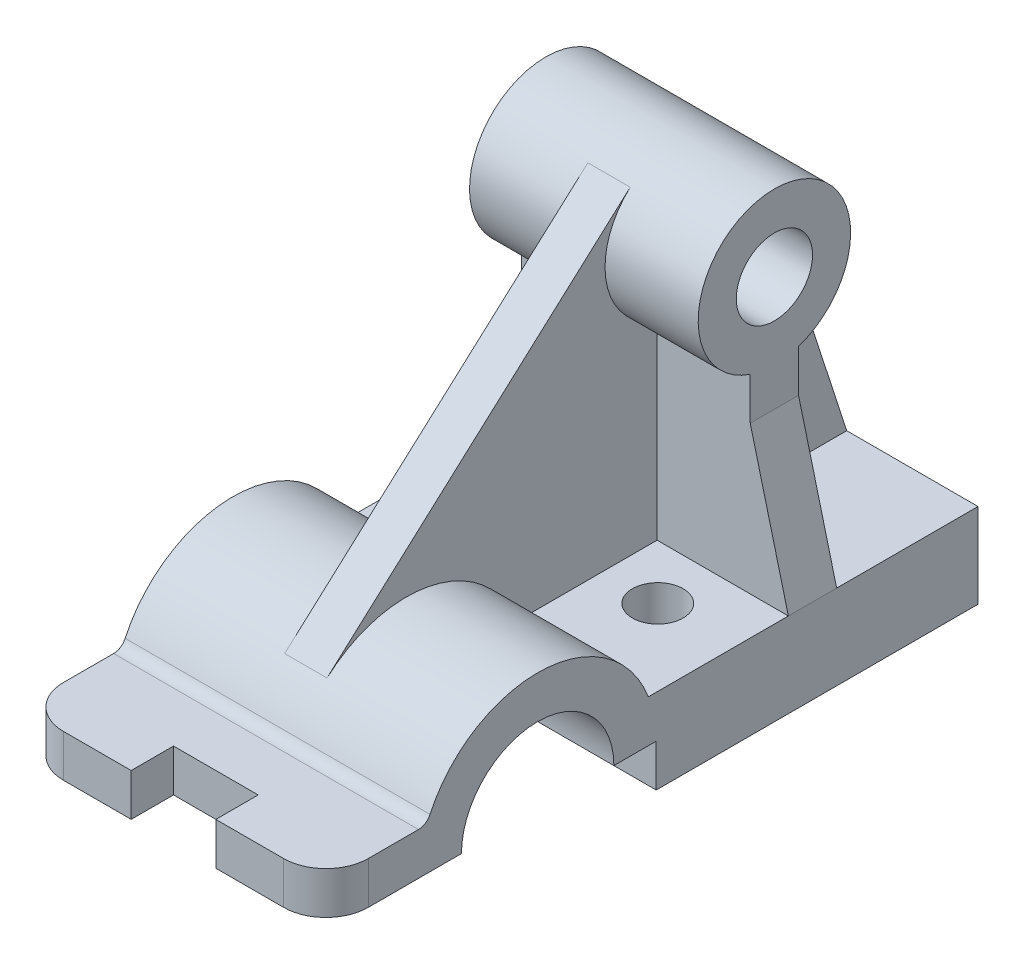
ISO-10303-21;
HEADER;
FILE_DESCRIPTION(('STEP AP214'),'2;1');
FILE_NAME('part.step','',(''),(''),'','','');
FILE_SCHEMA(('AUTOMOTIVE_DESIGN { 1 0 10303 214 1 1 1 1 }'));
ENDSEC;
DATA;
#1=APPLICATION_CONTEXT('core data for automotive mechanical design processes');
#2=APPLICATION_PROTOCOL_DEFINITION('international standard','automotive_design',2000,#1);
#3=PRODUCT_CONTEXT('',#1,'mechanical');
#4=PRODUCT('Part','Part','',(#3));
#5=PRODUCT_RELATED_PRODUCT_CATEGORY('part','',(#4));
#6=PRODUCT_DEFINITION_FORMATION('','',#4);
#7=PRODUCT_DEFINITION_CONTEXT('part definition',#1,'design');
#8=PRODUCT_DEFINITION('design','',#6,#7);
#9=PRODUCT_DEFINITION_SHAPE('','',#8);
#10=(LENGTH_UNIT() NAMED_UNIT(*) SI_UNIT(.MILLI.,.METRE.));
#11=(NAMED_UNIT(*) PLANE_ANGLE_UNIT() SI_UNIT($,.RADIAN.));
#12=(NAMED_UNIT(*) SI_UNIT($,.STERADIAN.) SOLID_ANGLE_UNIT());
#13=UNCERTAINTY_MEASURE_WITH_UNIT(LENGTH_MEASURE(1.E-05),#10,'distance_accuracy_value','');
#14=(GEOMETRIC_REPRESENTATION_CONTEXT(3) GLOBAL_UNCERTAINTY_ASSIGNED_CONTEXT((#13)) GLOBAL_UNIT_ASSIGNED_CONTEXT((#10,
#11,#12)) REPRESENTATION_CONTEXT('',''));
#15=CARTESIAN_POINT('',(0.,0.,0.));
#16=DIRECTION('',(0.,0.,1.));
#17=DIRECTION('',(1.,0.,0.));
#18=AXIS2_PLACEMENT_3D('',#15,#16,#17);
#19=CARTESIAN_POINT('',(-26.,20.,67.));
#20=DIRECTION('',(0.,-1.,0.));
#21=DIRECTION('',(0.,0.,-1.));
#22=AXIS2_PLACEMENT_3D('',#19,#20,#21);
#23=PLANE('',#22);
#24=DIRECTION('',(0.,0.,-1.));
#25=VECTOR('',#24,1.);
#26=CARTESIAN_POINT('',(-5.,20.,-43.6192714453584));
#27=LINE('',#26,#25);
#28=CARTESIAN_POINT('',(-5.,20.,-43.6192714453584));
#29=VERTEX_POINT('',#28);
#30=CARTESIAN_POINT('',(-5.,20.,-77.));
#31=VERTEX_POINT('',#30);
#32=EDGE_CURVE('E529',#29,#31,#27,.T.);
#33=ORIENTED_EDGE('',*,*,#32,.T.);
#34=DIRECTION('',(-1.,0.,0.));
#35=VECTOR('',#34,1.);
#36=CARTESIAN_POINT('',(-36.,20.,-77.));
#37=LINE('',#36,#35);
#38=CARTESIAN_POINT('',(-36.,20.,-77.));
#39=VERTEX_POINT('',#38);
#40=EDGE_CURVE('E413',#31,#39,#37,.T.);
#41=ORIENTED_EDGE('',*,*,#40,.T.);
#42=DIRECTION('',(0.,0.,1.));
#43=VECTOR('',#42,1.);
#44=CARTESIAN_POINT('',(-36.,20.,66.9999999999999));
#45=LINE('',#44,#43);
#46=CARTESIAN_POINT('',(-36.,20.,-43.6192714453584));
#47=VERTEX_POINT('',#46);
#48=EDGE_CURVE('E420',#39,#47,#45,.T.);
#49=ORIENTED_EDGE('',*,*,#48,.T.);
#50=DIRECTION('',(1.,0.,0.));
#51=VECTOR('',#50,1.);
#52=CARTESIAN_POINT('',(-26.,20.,-43.6192714453584));
#53=LINE('',#52,#51);
#54=EDGE_CURVE('E12',#47,#29,#53,.T.);
#55=ORIENTED_EDGE('',*,*,#54,.T.);
#56=EDGE_LOOP('',(#33,#41,#49,#55));
#57=FACE_BOUND('',#56,.T.);
#58=ADVANCED_FACE('F43',(#57),#23,.F.);
#59=CARTESIAN_POINT('',(36.,19.9278929021557,-43.6192714453584));
#60=DIRECTION('',(0.,0.,-1.));
#61=DIRECTION('',(-1.,0.,0.));
#62=AXIS2_PLACEMENT_3D('',#59,#60,#61);
#63=PLANE('',#62);
#64=DIRECTION('',(-1.,0.,0.));
#65=VECTOR('',#64,1.);
#66=CARTESIAN_POINT('',(36.,64.9278929021557,-43.6192714453584));
#67=LINE('',#66,#65);
#68=CARTESIAN_POINT('',(-5.,64.9278929021557,-43.6192714453584));
#69=VERTEX_POINT('',#68);
#70=CARTESIAN_POINT('',(-27.,64.9278929021557,-43.6192714453584));
#71=VERTEX_POINT('',#70);
#72=EDGE_CURVE('E280',#69,#71,#67,.T.);
#73=ORIENTED_EDGE('',*,*,#72,.F.);
#74=DIRECTION('',(0.,-1.,0.));
#75=VECTOR('',#74,1.);
#76=CARTESIAN_POINT('',(-5.,64.9278929021557,-43.6192714453584));
#77=LINE('',#76,#75);
#78=EDGE_CURVE('E58',#69,#29,#77,.T.);
#79=ORIENTED_EDGE('',*,*,#78,.T.);
#80=ORIENTED_EDGE('',*,*,#54,.F.);
#81=DIRECTION('',(-0.249523194065866,-0.968368822104041,0.));
#82=VECTOR('',#81,1.);
#83=CARTESIAN_POINT('',(-27.,54.9278929021557,-43.6192714453584));
#84=LINE('',#83,#82);
#85=CARTESIAN_POINT('',(-27.,54.9278929021557,-43.6192714453584));
#86=VERTEX_POINT('',#85);
#87=EDGE_CURVE('E511',#86,#47,#84,.T.);
#88=ORIENTED_EDGE('',*,*,#87,.F.);
#89=DIRECTION('',(0.,-1.,0.));
#90=VECTOR('',#89,1.);
#91=CARTESIAN_POINT('',(-27.,64.9278929021557,-43.6192714453584));
#92=LINE('',#91,#90);
#93=EDGE_CURVE('E514',#71,#86,#92,.T.);
#94=ORIENTED_EDGE('',*,*,#93,.F.);
#95=EDGE_LOOP('',(#73,#79,#80,#88,#94));
#96=FACE_BOUND('',#95,.T.);
#97=ADVANCED_FACE('F550',(#96),#63,.T.);
#98=CARTESIAN_POINT('',(18.,20.,-19.3671831588424));
#99=DIRECTION('',(0.,-1.,0.));
#100=DIRECTION('',(0.,0.,1.));
#101=AXIS2_PLACEMENT_3D('',#98,#99,#100);
#102=CIRCLE('',#101,6.);
#103=CARTESIAN_POINT('',(18.,20.,-13.3671831588424));
#104=VERTEX_POINT('',#103);
#105=EDGE_CURVE('E331',#104,#104,#102,.T.);
#106=ORIENTED_EDGE('',*,*,#105,.T.);
#107=EDGE_LOOP('',(#106));
#108=FACE_BOUND('',#107,.T.);
#109=DIRECTION('',(0.,0.,-1.));
#110=VECTOR('',#109,1.);
#111=CARTESIAN_POINT('',(36.,20.,66.9999999999999));
#112=LINE('',#111,#110);
#113=CARTESIAN_POINT('',(36.,20.,0.846606338755967));
#114=VERTEX_POINT('',#113);
#115=CARTESIAN_POINT('',(36.,20.,-32.2099490746416));
#116=VERTEX_POINT('',#115);
#117=EDGE_CURVE('E414',#114,#116,#112,.T.);
#118=ORIENTED_EDGE('',*,*,#117,.T.);
#119=DIRECTION('',(-1.,0.,0.));
#120=VECTOR('',#119,1.);
#121=CARTESIAN_POINT('',(-26.,20.,-32.2099490746416));
#122=LINE('',#121,#120);
#123=CARTESIAN_POINT('',(5.,20.,-32.2099490746416));
#124=VERTEX_POINT('',#123);
#125=EDGE_CURVE('E301',#116,#124,#122,.T.);
#126=ORIENTED_EDGE('',*,*,#125,.T.);
#127=DIRECTION('',(0.,0.,-1.));
#128=VECTOR('',#127,1.);
#129=CARTESIAN_POINT('',(5.,20.,0.846606338755959));
#130=LINE('',#129,#128);
#131=CARTESIAN_POINT('',(5.,20.,0.846606338755959));
#132=VERTEX_POINT('',#131);
#133=EDGE_CURVE('E304',#132,#124,#130,.T.);
#134=ORIENTED_EDGE('',*,*,#133,.F.);
#135=DIRECTION('',(-1.,0.,0.));
#136=VECTOR('',#135,1.);
#137=CARTESIAN_POINT('',(36.,20.,0.846606338755974));
#138=LINE('',#137,#136);
#139=EDGE_CURVE('E362',#132,#114,#138,.F.);
#140=ORIENTED_EDGE('',*,*,#139,.T.);
#141=EDGE_LOOP('',(#118,#126,#134,#140));
#142=FACE_BOUND('',#141,.T.);
#143=ADVANCED_FACE('F581',(#108,#142),#23,.F.);
#144=CARTESIAN_POINT('',(-18.,20.,-19.3671831588424));
#145=DIRECTION('',(0.,1.,0.));
#146=DIRECTION('',(0.,0.,1.));
#147=AXIS2_PLACEMENT_3D('',#144,#145,#146);
#148=CIRCLE('',#147,6.);
#149=CARTESIAN_POINT('',(-18.,20.,-13.3671831588424));
#150=VERTEX_POINT('',#149);
#151=EDGE_CURVE('E335',#150,#150,#148,.T.);
#152=ORIENTED_EDGE('',*,*,#151,.F.);
#153=EDGE_LOOP('',(#152));
#154=FACE_BOUND('',#153,.T.);
#155=DIRECTION('',(0.,0.,-1.));
#156=VECTOR('',#155,1.);
#157=CARTESIAN_POINT('',(-5.,20.,0.846606338755959));
#158=LINE('',#157,#156);
#159=CARTESIAN_POINT('',(-5.,20.,0.846606338755974));
#160=VERTEX_POINT('',#159);
#161=CARTESIAN_POINT('',(-5.,20.,-32.2099490746416));
#162=VERTEX_POINT('',#161);
#163=EDGE_CURVE('E318',#160,#162,#158,.T.);
#164=ORIENTED_EDGE('',*,*,#163,.T.);
#165=CARTESIAN_POINT('',(-36.,20.,-32.2099490746416));
#166=VERTEX_POINT('',#165);
#167=EDGE_CURVE('E66',#162,#166,#122,.T.);
#168=ORIENTED_EDGE('',*,*,#167,.T.);
#169=CARTESIAN_POINT('',(-36.,20.,0.846606338755967));
#170=VERTEX_POINT('',#169);
#171=EDGE_CURVE('E424',#166,#170,#45,.T.);
#172=ORIENTED_EDGE('',*,*,#171,.T.);
#173=EDGE_CURVE('E364',#170,#160,#138,.F.);
#174=ORIENTED_EDGE('',*,*,#173,.T.);
#175=EDGE_LOOP('',(#164,#168,#172,#174));
#176=FACE_BOUND('',#175,.T.);
#177=ADVANCED_FACE('F561',(#154,#176),#23,.F.);
#178=CARTESIAN_POINT('',(36.,10.,-0.999999999999987));
#179=DIRECTION('',(0.,1.,0.));
#180=DIRECTION('',(0.,0.,1.));
#181=AXIS2_PLACEMENT_3D('',#178,#179,#180);
#182=PLANE('',#181);
#183=DIRECTION('',(0.,0.,-1.));
#184=VECTOR('',#183,1.);
#185=CARTESIAN_POINT('',(36.,10.,-0.999999999999987));
#186=LINE('',#185,#184);
#187=CARTESIAN_POINT('',(36.,10.,9.00000000000001));
#188=VERTEX_POINT('',#187);
#189=CARTESIAN_POINT('',(36.,10.,-0.999999999999987));
#190=VERTEX_POINT('',#189);
#191=EDGE_CURVE('E388',#188,#190,#186,.T.);
#192=ORIENTED_EDGE('',*,*,#191,.F.);
#193=DIRECTION('',(-1.,0.,0.));
#194=VECTOR('',#193,1.);
#195=CARTESIAN_POINT('',(36.,10.,9.00000000000001));
#196=LINE('',#195,#194);
#197=CARTESIAN_POINT('',(-36.,10.,9.00000000000001));
#198=VERTEX_POINT('',#197);
#199=EDGE_CURVE('E470',#188,#198,#196,.T.);
#200=ORIENTED_EDGE('',*,*,#199,.T.);
#201=DIRECTION('',(0.,0.,-1.));
#202=VECTOR('',#201,1.);
#203=CARTESIAN_POINT('',(-36.,10.,-0.999999999999987));
#204=LINE('',#203,#202);
#205=CARTESIAN_POINT('',(-36.,10.,-0.999999999999987));
#206=VERTEX_POINT('',#205);
#207=EDGE_CURVE('E395',#198,#206,#204,.T.);
#208=ORIENTED_EDGE('',*,*,#207,.T.);
#209=DIRECTION('',(-1.,0.,0.));
#210=VECTOR('',#209,1.);
#211=CARTESIAN_POINT('',(36.,10.,-0.999999999999987));
#212=LINE('',#211,#210);
#213=EDGE_CURVE('E398',#190,#206,#212,.T.);
#214=ORIENTED_EDGE('',*,*,#213,.F.);
#215=EDGE_LOOP('',(#192,#200,#208,#214));
#216=FACE_BOUND('',#215,.T.);
#217=ADVANCED_FACE('F634',(#216),#182,.F.);
#218=CARTESIAN_POINT('',(36.,20.,66.9999999999999));
#219=VERTEX_POINT('',#218);
#220=CARTESIAN_POINT('',(36.,20.,55.1424945589406));
#221=VERTEX_POINT('',#220);
#222=EDGE_CURVE('E411',#219,#221,#112,.T.);
#223=ORIENTED_EDGE('',*,*,#222,.T.);
#224=DIRECTION('',(-1.,0.,0.));
#225=VECTOR('',#224,1.);
#226=CARTESIAN_POINT('',(36.,20.,55.1424945589406));
#227=LINE('',#226,#225);
#228=CARTESIAN_POINT('',(-36.,20.,55.1424945589406));
#229=VERTEX_POINT('',#228);
#230=EDGE_CURVE('E360',#221,#229,#227,.T.);
#231=ORIENTED_EDGE('',*,*,#230,.T.);
#232=CARTESIAN_POINT('',(-36.,20.,66.9999999999999));
#233=VERTEX_POINT('',#232);
#234=EDGE_CURVE('E419',#229,#233,#45,.T.);
#235=ORIENTED_EDGE('',*,*,#234,.T.);
#236=CARTESIAN_POINT('',(-26.,20.,67.));
#237=DIRECTION('',(0.,1.,0.));
#238=DIRECTION('',(0.,0.,-1.));
#239=AXIS2_PLACEMENT_3D('',#236,#237,#238);
#240=CIRCLE('',#239,10.);
#241=CARTESIAN_POINT('',(-25.9999999999999,20.,77.));
#242=VERTEX_POINT('',#241);
#243=EDGE_CURVE('E423',#233,#242,#240,.T.);
#244=ORIENTED_EDGE('',*,*,#243,.T.);
#245=DIRECTION('',(1.,0.,0.));
#246=VECTOR('',#245,1.);
#247=CARTESIAN_POINT('',(-25.9999999999999,20.,77.));
#248=LINE('',#247,#246);
#249=CARTESIAN_POINT('',(-10.,20.,77.));
#250=VERTEX_POINT('',#249);
#251=EDGE_CURVE('E427',#242,#250,#248,.T.);
#252=ORIENTED_EDGE('',*,*,#251,.T.);
#253=DIRECTION('',(0.,0.,1.));
#254=VECTOR('',#253,1.);
#255=CARTESIAN_POINT('',(-10.,20.,77.));
#256=LINE('',#255,#254);
#257=CARTESIAN_POINT('',(-10.,20.,67.));
#258=VERTEX_POINT('',#257);
#259=EDGE_CURVE('E367',#258,#250,#256,.T.);
#260=ORIENTED_EDGE('',*,*,#259,.F.);
#261=DIRECTION('',(-1.,0.,0.));
#262=VECTOR('',#261,1.);
#263=CARTESIAN_POINT('',(-10.,20.,67.));
#264=LINE('',#263,#262);
#265=CARTESIAN_POINT('',(10.,20.,67.));
#266=VERTEX_POINT('',#265);
#267=EDGE_CURVE('E372',#266,#258,#264,.T.);
#268=ORIENTED_EDGE('',*,*,#267,.F.);
#269=DIRECTION('',(0.,0.,-1.));
#270=VECTOR('',#269,1.);
#271=CARTESIAN_POINT('',(10.,20.,77.));
#272=LINE('',#271,#270);
#273=CARTESIAN_POINT('',(10.,20.,77.));
#274=VERTEX_POINT('',#273);
#275=EDGE_CURVE('E369',#274,#266,#272,.T.);
#276=ORIENTED_EDGE('',*,*,#275,.F.);
#277=CARTESIAN_POINT('',(25.9999999999999,20.,77.));
#278=VERTEX_POINT('',#277);
#279=EDGE_CURVE('E426',#274,#278,#248,.T.);
#280=ORIENTED_EDGE('',*,*,#279,.T.);
#281=CARTESIAN_POINT('',(26.,20.,67.));
#282=DIRECTION('',(0.,1.,0.));
#283=DIRECTION('',(0.,0.,-1.));
#284=AXIS2_PLACEMENT_3D('',#281,#282,#283);
#285=CIRCLE('',#284,10.);
#286=EDGE_CURVE('E430',#278,#219,#285,.T.);
#287=ORIENTED_EDGE('',*,*,#286,.T.);
#288=EDGE_LOOP('',(#223,#231,#235,#244,#252,#260,#268,#276,#280,#287));
#289=FACE_BOUND('',#288,.T.);
#290=ADVANCED_FACE('F620',(#289),#23,.F.);
#291=CARTESIAN_POINT('',(-25.9999999999999,20.,77.));
#292=DIRECTION('',(0.,0.,-1.));
#293=DIRECTION('',(-1.,0.,0.));
#294=AXIS2_PLACEMENT_3D('',#291,#292,#293);
#295=PLANE('',#294);
#296=DIRECTION('',(-1.,0.,0.));
#297=VECTOR('',#296,1.);
#298=CARTESIAN_POINT('',(36.,10.,77.));
#299=LINE('',#298,#297);
#300=CARTESIAN_POINT('',(-10.,10.,77.));
#301=VERTEX_POINT('',#300);
#302=CARTESIAN_POINT('',(-25.9999999999999,10.,77.));
#303=VERTEX_POINT('',#302);
#304=EDGE_CURVE('E405',#301,#303,#299,.T.);
#305=ORIENTED_EDGE('',*,*,#304,.F.);
#306=DIRECTION('',(0.,1.,0.));
#307=VECTOR('',#306,1.);
#308=CARTESIAN_POINT('',(-10.,0.,77.));
#309=LINE('',#308,#307);
#310=EDGE_CURVE('E375',#301,#250,#309,.T.);
#311=ORIENTED_EDGE('',*,*,#310,.T.);
#312=ORIENTED_EDGE('',*,*,#251,.F.);
#313=DIRECTION('',(0.,-1.,0.));
#314=VECTOR('',#313,1.);
#315=CARTESIAN_POINT('',(-25.9999999999999,20.,77.));
#316=LINE('',#315,#314);
#317=EDGE_CURVE('E444',#242,#303,#316,.T.);
#318=ORIENTED_EDGE('',*,*,#317,.T.);
#319=EDGE_LOOP('',(#305,#311,#312,#318));
#320=FACE_BOUND('',#319,.T.);
#321=ADVANCED_FACE('F633',(#320),#295,.F.);
#322=CARTESIAN_POINT('',(36.,20.,66.9999999999999));
#323=DIRECTION('',(-1.,0.,0.));
#324=DIRECTION('',(0.,0.,1.));
#325=AXIS2_PLACEMENT_3D('',#322,#323,#324);
#326=PLANE('',#325);
#327=DIRECTION('',(0.,0.,-1.));
#328=VECTOR('',#327,1.);
#329=CARTESIAN_POINT('',(36.,20.,77.001));
#330=LINE('',#329,#328);
#331=CARTESIAN_POINT('',(36.,20.,-43.6192714453584));
#332=VERTEX_POINT('',#331);
#333=EDGE_CURVE('E484',#116,#332,#330,.T.);
#334=ORIENTED_EDGE('',*,*,#333,.F.);
#335=ORIENTED_EDGE('',*,*,#117,.F.);
#336=CARTESIAN_POINT('',(36.,10.,27.));
#337=DIRECTION('',(-1.,0.,0.));
#338=DIRECTION('',(0.,0.,1.));
#339=AXIS2_PLACEMENT_3D('',#336,#337,#338);
#340=CIRCLE('',#339,28.);
#341=CARTESIAN_POINT('',(36.,21.741935483871,52.4190273435592));
#342=VERTEX_POINT('',#341);
#343=EDGE_CURVE('E347',#342,#114,#340,.T.);
#344=ORIENTED_EDGE('',*,*,#343,.F.);
#345=CARTESIAN_POINT('',(36.,23.,55.1424945589406));
#346=DIRECTION('',(-1.,0.,0.));
#347=DIRECTION('',(0.,0.,1.));
#348=AXIS2_PLACEMENT_3D('',#345,#346,#347);
#349=CIRCLE('',#348,3.);
#350=EDGE_CURVE('E344',#342,#221,#349,.T.);
#351=ORIENTED_EDGE('',*,*,#350,.T.);
#352=ORIENTED_EDGE('',*,*,#222,.F.);
#353=DIRECTION('',(0.,-1.,0.));
#354=VECTOR('',#353,1.);
#355=CARTESIAN_POINT('',(36.,20.,66.9999999999999));
#356=LINE('',#355,#354);
#357=CARTESIAN_POINT('',(36.,10.,67.));
#358=VERTEX_POINT('',#357);
#359=EDGE_CURVE('E432',#219,#358,#356,.T.);
#360=ORIENTED_EDGE('',*,*,#359,.T.);
#361=CARTESIAN_POINT('',(36.,10.,45.));
#362=VERTEX_POINT('',#361);
#363=EDGE_CURVE('E390',#358,#362,#186,.T.);
#364=ORIENTED_EDGE('',*,*,#363,.T.);
#365=CARTESIAN_POINT('',(36.,10.,27.));
#366=DIRECTION('',(-1.,0.,0.));
#367=DIRECTION('',(0.,0.,1.));
#368=AXIS2_PLACEMENT_3D('',#365,#366,#367);
#369=CIRCLE('',#368,18.);
#370=EDGE_CURVE('E351',#362,#188,#369,.T.);
#371=ORIENTED_EDGE('',*,*,#370,.T.);
#372=ORIENTED_EDGE('',*,*,#191,.T.);
#373=DIRECTION('',(0.,-1.,0.));
#374=VECTOR('',#373,1.);
#375=CARTESIAN_POINT('',(36.,0.,-0.999999999999987));
#376=LINE('',#375,#374);
#377=CARTESIAN_POINT('',(36.,0.,-0.999999999999987));
#378=VERTEX_POINT('',#377);
#379=EDGE_CURVE('E385',#190,#378,#376,.T.);
#380=ORIENTED_EDGE('',*,*,#379,.T.);
#381=DIRECTION('',(0.,0.,-1.));
#382=VECTOR('',#381,1.);
#383=CARTESIAN_POINT('',(36.,0.,66.9999999999999));
#384=LINE('',#383,#382);
#385=CARTESIAN_POINT('',(36.,0.,-77.));
#386=VERTEX_POINT('',#385);
#387=EDGE_CURVE('E410',#378,#386,#384,.T.);
#388=ORIENTED_EDGE('',*,*,#387,.T.);
#389=DIRECTION('',(0.,-1.,0.));
#390=VECTOR('',#389,1.);
#391=CARTESIAN_POINT('',(36.,20.,-77.));
#392=LINE('',#391,#390);
#393=CARTESIAN_POINT('',(36.,20.,-77.));
#394=VERTEX_POINT('',#393);
#395=EDGE_CURVE('E453',#394,#386,#392,.T.);
#396=ORIENTED_EDGE('',*,*,#395,.F.);
#397=EDGE_CURVE('E415',#332,#394,#112,.T.);
#398=ORIENTED_EDGE('',*,*,#397,.F.);
#399=EDGE_LOOP('',(#334,#335,#344,#351,#352,#360,#364,#371,#372,#380,#388,#396,#398));
#400=FACE_BOUND('',#399,.T.);
#401=ADVANCED_FACE('F45',(#400),#326,.F.);
#402=CARTESIAN_POINT('',(-36.,20.,-77.));
#403=DIRECTION('',(0.,0.,1.));
#404=DIRECTION('',(1.,0.,0.));
#405=AXIS2_PLACEMENT_3D('',#402,#403,#404);
#406=PLANE('',#405);
#407=DIRECTION('',(-1.,0.,0.));
#408=VECTOR('',#407,1.);
#409=CARTESIAN_POINT('',(-36.,0.,-77.));
#410=LINE('',#409,#408);
#411=CARTESIAN_POINT('',(-36.,0.,-77.));
#412=VERTEX_POINT('',#411);
#413=EDGE_CURVE('E434',#386,#412,#410,.T.);
#414=ORIENTED_EDGE('',*,*,#413,.T.);
#415=DIRECTION('',(0.,-1.,0.));
#416=VECTOR('',#415,1.);
#417=CARTESIAN_POINT('',(-36.,20.,-77.));
#418=LINE('',#417,#416);
#419=EDGE_CURVE('E450',#39,#412,#418,.T.);
#420=ORIENTED_EDGE('',*,*,#419,.F.);
#421=ORIENTED_EDGE('',*,*,#40,.F.);
#422=DIRECTION('',(-1.,0.,0.));
#423=VECTOR('',#422,1.);
#424=CARTESIAN_POINT('',(5.,20.,-77.));
#425=LINE('',#424,#423);
#426=CARTESIAN_POINT('',(5.,20.,-77.));
#427=VERTEX_POINT('',#426);
#428=EDGE_CURVE('E508',#427,#31,#425,.T.);
#429=ORIENTED_EDGE('',*,*,#428,.F.);
#430=EDGE_CURVE('E416',#394,#427,#37,.T.);
#431=ORIENTED_EDGE('',*,*,#430,.F.);
#432=ORIENTED_EDGE('',*,*,#395,.T.);
#433=EDGE_LOOP('',(#414,#420,#421,#429,#431,#432));
#434=FACE_BOUND('',#433,.T.);
#435=ADVANCED_FACE('F542',(#434),#406,.F.);
#436=CARTESIAN_POINT('',(-36.,20.,66.9999999999999));
#437=DIRECTION('',(1.,0.,0.));
#438=DIRECTION('',(0.,0.,-1.));
#439=AXIS2_PLACEMENT_3D('',#436,#437,#438);
#440=PLANE('',#439);
#441=ORIENTED_EDGE('',*,*,#171,.F.);
#442=DIRECTION('',(0.,0.,-1.));
#443=VECTOR('',#442,1.);
#444=CARTESIAN_POINT('',(-36.,20.,77.001));
#445=LINE('',#444,#443);
#446=EDGE_CURVE('E507',#166,#47,#445,.T.);
#447=ORIENTED_EDGE('',*,*,#446,.T.);
#448=ORIENTED_EDGE('',*,*,#48,.F.);
#449=ORIENTED_EDGE('',*,*,#419,.T.);
#450=DIRECTION('',(0.,0.,1.));
#451=VECTOR('',#450,1.);
#452=CARTESIAN_POINT('',(-36.,0.,66.9999999999999));
#453=LINE('',#452,#451);
#454=CARTESIAN_POINT('',(-36.,0.,-0.999999999999987));
#455=VERTEX_POINT('',#454);
#456=EDGE_CURVE('E436',#412,#455,#453,.T.);
#457=ORIENTED_EDGE('',*,*,#456,.T.);
#458=DIRECTION('',(0.,-1.,0.));
#459=VECTOR('',#458,1.);
#460=CARTESIAN_POINT('',(-36.,0.,-0.999999999999987));
#461=LINE('',#460,#459);
#462=EDGE_CURVE('E378',#206,#455,#461,.T.);
#463=ORIENTED_EDGE('',*,*,#462,.F.);
#464=ORIENTED_EDGE('',*,*,#207,.F.);
#465=CARTESIAN_POINT('',(-36.,10.,27.));
#466=DIRECTION('',(-1.,0.,0.));
#467=DIRECTION('',(0.,0.,1.));
#468=AXIS2_PLACEMENT_3D('',#465,#466,#467);
#469=CIRCLE('',#468,18.);
#470=CARTESIAN_POINT('',(-36.,10.,45.));
#471=VERTEX_POINT('',#470);
#472=EDGE_CURVE('E348',#471,#198,#469,.T.);
#473=ORIENTED_EDGE('',*,*,#472,.F.);
#474=CARTESIAN_POINT('',(-36.,10.,67.));
#475=VERTEX_POINT('',#474);
#476=EDGE_CURVE('E389',#475,#471,#204,.T.);
#477=ORIENTED_EDGE('',*,*,#476,.F.);
#478=DIRECTION('',(0.,-1.,0.));
#479=VECTOR('',#478,1.);
#480=CARTESIAN_POINT('',(-36.,20.,66.9999999999999));
#481=LINE('',#480,#479);
#482=EDGE_CURVE('E447',#233,#475,#481,.T.);
#483=ORIENTED_EDGE('',*,*,#482,.F.);
#484=ORIENTED_EDGE('',*,*,#234,.F.);
#485=CARTESIAN_POINT('',(-36.,23.,55.1424945589406));
#486=DIRECTION('',(-1.,0.,0.));
#487=DIRECTION('',(0.,0.,1.));
#488=AXIS2_PLACEMENT_3D('',#485,#486,#487);
#489=CIRCLE('',#488,3.);
#490=CARTESIAN_POINT('',(-36.,21.741935483871,52.4190273435592));
#491=VERTEX_POINT('',#490);
#492=EDGE_CURVE('E341',#491,#229,#489,.T.);
#493=ORIENTED_EDGE('',*,*,#492,.F.);
#494=CARTESIAN_POINT('',(-36.,10.,27.));
#495=DIRECTION('',(-1.,0.,0.));
#496=DIRECTION('',(0.,0.,1.));
#497=AXIS2_PLACEMENT_3D('',#494,#495,#496);
#498=CIRCLE('',#497,28.);
#499=EDGE_CURVE('E356',#491,#170,#498,.T.);
#500=ORIENTED_EDGE('',*,*,#499,.T.);
#501=EDGE_LOOP('',(#441,#447,#448,#449,#457,#463,#464,#473,#477,#483,#484,#493,#500));
#502=FACE_BOUND('',#501,.T.);
#503=ADVANCED_FACE('F569',(#502),#440,.F.);
#504=CARTESIAN_POINT('',(-26.,20.,67.));
#505=DIRECTION('',(0.,-1.,0.));
#506=DIRECTION('',(0.,0.,-1.));
#507=AXIS2_PLACEMENT_3D('',#504,#505,#506);
#508=CYLINDRICAL_SURFACE('',#507,10.);
#509=ORIENTED_EDGE('',*,*,#482,.T.);
#510=CARTESIAN_POINT('',(-26.,10.,67.));
#511=DIRECTION('',(0.,1.,0.));
#512=DIRECTION('',(0.,0.,1.));
#513=AXIS2_PLACEMENT_3D('',#510,#511,#512);
#514=CIRCLE('',#513,10.);
#515=EDGE_CURVE('E401',#475,#303,#514,.T.);
#516=ORIENTED_EDGE('',*,*,#515,.T.);
#517=ORIENTED_EDGE('',*,*,#317,.F.);
#518=ORIENTED_EDGE('',*,*,#243,.F.);
#519=EDGE_LOOP('',(#509,#516,#517,#518));
#520=FACE_BOUND('',#519,.T.);
#521=ADVANCED_FACE('F856',(#520),#508,.T.);
#522=ORIENTED_EDGE('',*,*,#279,.F.);
#523=DIRECTION('',(0.,1.,0.));
#524=VECTOR('',#523,1.);
#525=CARTESIAN_POINT('',(10.,0.,77.));
#526=LINE('',#525,#524);
#527=CARTESIAN_POINT('',(10.,10.,77.));
#528=VERTEX_POINT('',#527);
#529=EDGE_CURVE('E381',#528,#274,#526,.T.);
#530=ORIENTED_EDGE('',*,*,#529,.F.);
#531=CARTESIAN_POINT('',(26.,10.,77.));
#532=VERTEX_POINT('',#531);
#533=EDGE_CURVE('E402',#532,#528,#299,.T.);
#534=ORIENTED_EDGE('',*,*,#533,.F.);
#535=DIRECTION('',(0.,-1.,0.));
#536=VECTOR('',#535,1.);
#537=CARTESIAN_POINT('',(25.9999999999999,20.,77.));
#538=LINE('',#537,#536);
#539=EDGE_CURVE('E441',#278,#532,#538,.T.);
#540=ORIENTED_EDGE('',*,*,#539,.F.);
#541=EDGE_LOOP('',(#522,#530,#534,#540));
#542=FACE_BOUND('',#541,.T.);
#543=ADVANCED_FACE('F629',(#542),#295,.F.);
#544=CARTESIAN_POINT('',(26.,20.,67.));
#545=DIRECTION('',(0.,-1.,0.));
#546=DIRECTION('',(0.,0.,-1.));
#547=AXIS2_PLACEMENT_3D('',#544,#545,#546);
#548=CYLINDRICAL_SURFACE('',#547,10.);
#549=ORIENTED_EDGE('',*,*,#539,.T.);
#550=CARTESIAN_POINT('',(26.,10.,67.));
#551=DIRECTION('',(0.,1.,0.));
#552=DIRECTION('',(0.,0.,1.));
#553=AXIS2_PLACEMENT_3D('',#550,#551,#552);
#554=CIRCLE('',#553,10.);
#555=EDGE_CURVE('E456',#532,#358,#554,.T.);
#556=ORIENTED_EDGE('',*,*,#555,.T.);
#557=ORIENTED_EDGE('',*,*,#359,.F.);
#558=ORIENTED_EDGE('',*,*,#286,.F.);
#559=EDGE_LOOP('',(#549,#556,#557,#558));
#560=FACE_BOUND('',#559,.T.);
#561=ADVANCED_FACE('F619',(#560),#548,.T.);
#562=ORIENTED_EDGE('',*,*,#430,.T.);
#563=DIRECTION('',(0.,0.,-1.));
#564=VECTOR('',#563,1.);
#565=CARTESIAN_POINT('',(5.,20.,-43.6192714453584));
#566=LINE('',#565,#564);
#567=CARTESIAN_POINT('',(5.,20.,-43.6192714453584));
#568=VERTEX_POINT('',#567);
#569=EDGE_CURVE('E273',#568,#427,#566,.T.);
#570=ORIENTED_EDGE('',*,*,#569,.F.);
#571=EDGE_CURVE('E51',#568,#332,#53,.T.);
#572=ORIENTED_EDGE('',*,*,#571,.T.);
#573=ORIENTED_EDGE('',*,*,#397,.T.);
#574=EDGE_LOOP('',(#562,#570,#572,#573));
#575=FACE_BOUND('',#574,.T.);
#576=ADVANCED_FACE('F478',(#575),#23,.F.);
#577=CARTESIAN_POINT('',(-26.,0.,67.));
#578=DIRECTION('',(0.,-1.,0.));
#579=DIRECTION('',(0.,0.,-1.));
#580=AXIS2_PLACEMENT_3D('',#577,#578,#579);
#581=PLANE('',#580);
#582=CARTESIAN_POINT('',(18.,0.,-19.3671831588424));
#583=DIRECTION('',(0.,-1.,0.));
#584=DIRECTION('',(0.,0.,1.));
#585=AXIS2_PLACEMENT_3D('',#582,#583,#584);
#586=CIRCLE('',#585,6.);
#587=CARTESIAN_POINT('',(18.,0.,-13.3671831588424));
#588=VERTEX_POINT('',#587);
#589=EDGE_CURVE('E332',#588,#588,#586,.T.);
#590=ORIENTED_EDGE('',*,*,#589,.F.);
#591=EDGE_LOOP('',(#590));
#592=FACE_BOUND('',#591,.T.);
#593=CARTESIAN_POINT('',(-18.,0.,-19.3671831588424));
#594=DIRECTION('',(0.,1.,0.));
#595=DIRECTION('',(0.,0.,1.));
#596=AXIS2_PLACEMENT_3D('',#593,#594,#595);
#597=CIRCLE('',#596,6.);
#598=CARTESIAN_POINT('',(-18.,0.,-13.3671831588424));
#599=VERTEX_POINT('',#598);
#600=EDGE_CURVE('E338',#599,#599,#597,.T.);
#601=ORIENTED_EDGE('',*,*,#600,.T.);
#602=EDGE_LOOP('',(#601));
#603=FACE_BOUND('',#602,.T.);
#604=DIRECTION('',(-1.,0.,0.));
#605=VECTOR('',#604,1.);
#606=CARTESIAN_POINT('',(36.,0.,-0.999999999999987));
#607=LINE('',#606,#605);
#608=EDGE_CURVE('E393',#378,#455,#607,.T.);
#609=ORIENTED_EDGE('',*,*,#608,.T.);
#610=ORIENTED_EDGE('',*,*,#456,.F.);
#611=ORIENTED_EDGE('',*,*,#413,.F.);
#612=ORIENTED_EDGE('',*,*,#387,.F.);
#613=EDGE_LOOP('',(#609,#610,#611,#612));
#614=FACE_BOUND('',#613,.T.);
#615=ADVANCED_FACE('F618',(#592,#603,#614),#581,.T.);
#616=ORIENTED_EDGE('',*,*,#476,.T.);
#617=DIRECTION('',(-1.,0.,0.));
#618=VECTOR('',#617,1.);
#619=CARTESIAN_POINT('',(36.,10.,45.));
#620=LINE('',#619,#618);
#621=EDGE_CURVE('E468',#471,#362,#620,.F.);
#622=ORIENTED_EDGE('',*,*,#621,.T.);
#623=ORIENTED_EDGE('',*,*,#363,.F.);
#624=ORIENTED_EDGE('',*,*,#555,.F.);
#625=ORIENTED_EDGE('',*,*,#533,.T.);
#626=DIRECTION('',(0.,0.,-1.));
#627=VECTOR('',#626,1.);
#628=CARTESIAN_POINT('',(9.99999999999999,10.,-0.999999999999982));
#629=LINE('',#628,#627);
#630=CARTESIAN_POINT('',(10.,10.,67.));
#631=VERTEX_POINT('',#630);
#632=EDGE_CURVE('E459',#528,#631,#629,.T.);
#633=ORIENTED_EDGE('',*,*,#632,.T.);
#634=DIRECTION('',(-1.,0.,0.));
#635=VECTOR('',#634,1.);
#636=CARTESIAN_POINT('',(36.,10.,67.));
#637=LINE('',#636,#635);
#638=CARTESIAN_POINT('',(-10.,10.,67.));
#639=VERTEX_POINT('',#638);
#640=EDGE_CURVE('E462',#631,#639,#637,.T.);
#641=ORIENTED_EDGE('',*,*,#640,.T.);
#642=DIRECTION('',(0.,0.,1.));
#643=VECTOR('',#642,1.);
#644=CARTESIAN_POINT('',(-9.99999999999999,10.,-0.999999999999995));
#645=LINE('',#644,#643);
#646=EDGE_CURVE('E465',#639,#301,#645,.T.);
#647=ORIENTED_EDGE('',*,*,#646,.T.);
#648=ORIENTED_EDGE('',*,*,#304,.T.);
#649=ORIENTED_EDGE('',*,*,#515,.F.);
#650=EDGE_LOOP('',(#616,#622,#623,#624,#625,#633,#641,#647,#648,#649));
#651=FACE_BOUND('',#650,.T.);
#652=ADVANCED_FACE('F626',(#651),#182,.F.);
#653=CARTESIAN_POINT('',(36.,0.,-0.999999999999987));
#654=DIRECTION('',(0.,0.,-1.));
#655=DIRECTION('',(-1.,0.,0.));
#656=AXIS2_PLACEMENT_3D('',#653,#654,#655);
#657=PLANE('',#656);
#658=ORIENTED_EDGE('',*,*,#462,.T.);
#659=ORIENTED_EDGE('',*,*,#608,.F.);
#660=ORIENTED_EDGE('',*,*,#379,.F.);
#661=ORIENTED_EDGE('',*,*,#213,.T.);
#662=EDGE_LOOP('',(#658,#659,#660,#661));
#663=FACE_BOUND('',#662,.T.);
#664=ADVANCED_FACE('F674',(#663),#657,.F.);
#665=CARTESIAN_POINT('',(-10.,0.,77.));
#666=DIRECTION('',(-1.,0.,0.));
#667=DIRECTION('',(0.,0.,1.));
#668=AXIS2_PLACEMENT_3D('',#665,#666,#667);
#669=PLANE('',#668);
#670=DIRECTION('',(0.,1.,0.));
#671=VECTOR('',#670,1.);
#672=CARTESIAN_POINT('',(-10.,0.,67.));
#673=LINE('',#672,#671);
#674=EDGE_CURVE('E376',#639,#258,#673,.T.);
#675=ORIENTED_EDGE('',*,*,#674,.T.);
#676=ORIENTED_EDGE('',*,*,#259,.T.);
#677=ORIENTED_EDGE('',*,*,#310,.F.);
#678=ORIENTED_EDGE('',*,*,#646,.F.);
#679=EDGE_LOOP('',(#675,#676,#677,#678));
#680=FACE_BOUND('',#679,.T.);
#681=ADVANCED_FACE('F669',(#680),#669,.F.);
#682=CARTESIAN_POINT('',(-10.,0.,67.));
#683=DIRECTION('',(0.,0.,-1.));
#684=DIRECTION('',(-1.,0.,0.));
#685=AXIS2_PLACEMENT_3D('',#682,#683,#684);
#686=PLANE('',#685);
#687=DIRECTION('',(0.,1.,0.));
#688=VECTOR('',#687,1.);
#689=CARTESIAN_POINT('',(10.,0.,67.));
#690=LINE('',#689,#688);
#691=EDGE_CURVE('E379',#631,#266,#690,.T.);
#692=ORIENTED_EDGE('',*,*,#691,.T.);
#693=ORIENTED_EDGE('',*,*,#267,.T.);
#694=ORIENTED_EDGE('',*,*,#674,.F.);
#695=ORIENTED_EDGE('',*,*,#640,.F.);
#696=EDGE_LOOP('',(#692,#693,#694,#695));
#697=FACE_BOUND('',#696,.T.);
#698=ADVANCED_FACE('F666',(#697),#686,.F.);
#699=CARTESIAN_POINT('',(10.,0.,77.));
#700=DIRECTION('',(1.,0.,0.));
#701=DIRECTION('',(0.,0.,-1.));
#702=AXIS2_PLACEMENT_3D('',#699,#700,#701);
#703=PLANE('',#702);
#704=ORIENTED_EDGE('',*,*,#529,.T.);
#705=ORIENTED_EDGE('',*,*,#275,.T.);
#706=ORIENTED_EDGE('',*,*,#691,.F.);
#707=ORIENTED_EDGE('',*,*,#632,.F.);
#708=EDGE_LOOP('',(#704,#705,#706,#707));
#709=FACE_BOUND('',#708,.T.);
#710=ADVANCED_FACE('F663',(#709),#703,.F.);
#711=CARTESIAN_POINT('',(36.,10.,27.));
#712=DIRECTION('',(-1.,0.,0.));
#713=DIRECTION('',(0.,0.,1.));
#714=AXIS2_PLACEMENT_3D('',#711,#712,#713);
#715=CYLINDRICAL_SURFACE('',#714,18.);
#716=ORIENTED_EDGE('',*,*,#370,.F.);
#717=ORIENTED_EDGE('',*,*,#621,.F.);
#718=ORIENTED_EDGE('',*,*,#472,.T.);
#719=ORIENTED_EDGE('',*,*,#199,.F.);
#720=EDGE_LOOP('',(#716,#717,#718,#719));
#721=FACE_BOUND('',#720,.T.);
#722=ADVANCED_FACE('F661',(#721),#715,.F.);
#723=CARTESIAN_POINT('',(36.,10.,27.));
#724=DIRECTION('',(-1.,0.,0.));
#725=DIRECTION('',(0.,0.,1.));
#726=AXIS2_PLACEMENT_3D('',#723,#724,#725);
#727=CYLINDRICAL_SURFACE('',#726,28.);
#728=CARTESIAN_POINT('',(5.,9.99999999999999,27.));
#729=DIRECTION('',(-1.,0.,0.));
#730=DIRECTION('',(0.,0.,-1.));
#731=AXIS2_PLACEMENT_3D('',#728,#729,#730);
#732=CIRCLE('',#731,28.);
#733=CARTESIAN_POINT('',(5.,30.7944334393912,45.7507743289372));
#734=VERTEX_POINT('',#733);
#735=EDGE_CURVE('E302',#734,#132,#732,.T.);
#736=ORIENTED_EDGE('',*,*,#735,.F.);
#737=DIRECTION('',(-1.,0.,0.));
#738=VECTOR('',#737,1.);
#739=CARTESIAN_POINT('',(5.,30.7944334393912,45.7507743289372));
#740=LINE('',#739,#738);
#741=CARTESIAN_POINT('',(-5.,30.7944334393912,45.7507743289372));
#742=VERTEX_POINT('',#741);
#743=EDGE_CURVE('E314',#734,#742,#740,.T.);
#744=ORIENTED_EDGE('',*,*,#743,.T.);
#745=CARTESIAN_POINT('',(-5.,9.99999999999999,27.));
#746=DIRECTION('',(-1.,0.,0.));
#747=DIRECTION('',(0.,0.,-1.));
#748=AXIS2_PLACEMENT_3D('',#745,#746,#747);
#749=CIRCLE('',#748,28.);
#750=EDGE_CURVE('E315',#742,#160,#749,.T.);
#751=ORIENTED_EDGE('',*,*,#750,.T.);
#752=ORIENTED_EDGE('',*,*,#173,.F.);
#753=ORIENTED_EDGE('',*,*,#499,.F.);
#754=DIRECTION('',(-1.,0.,0.));
#755=VECTOR('',#754,1.);
#756=CARTESIAN_POINT('',(36.,21.741935483871,52.4190273435592));
#757=LINE('',#756,#755);
#758=EDGE_CURVE('E353',#342,#491,#757,.T.);
#759=ORIENTED_EDGE('',*,*,#758,.F.);
#760=ORIENTED_EDGE('',*,*,#343,.T.);
#761=ORIENTED_EDGE('',*,*,#139,.F.);
#762=EDGE_LOOP('',(#736,#744,#751,#752,#753,#759,#760,#761));
#763=FACE_BOUND('',#762,.T.);
#764=ADVANCED_FACE('F566',(#763),#727,.T.);
#765=CARTESIAN_POINT('',(36.,23.,55.1424945589406));
#766=DIRECTION('',(-1.,0.,0.));
#767=DIRECTION('',(0.,0.,1.));
#768=AXIS2_PLACEMENT_3D('',#765,#766,#767);
#769=CYLINDRICAL_SURFACE('',#768,3.);
#770=ORIENTED_EDGE('',*,*,#492,.T.);
#771=ORIENTED_EDGE('',*,*,#230,.F.);
#772=ORIENTED_EDGE('',*,*,#350,.F.);
#773=ORIENTED_EDGE('',*,*,#758,.T.);
#774=EDGE_LOOP('',(#770,#771,#772,#773));
#775=FACE_BOUND('',#774,.T.);
#776=ADVANCED_FACE('F575',(#775),#769,.F.);
#777=CARTESIAN_POINT('',(-18.,0.,-19.3671831588424));
#778=DIRECTION('',(0.,1.,0.));
#779=DIRECTION('',(0.,0.,1.));
#780=AXIS2_PLACEMENT_3D('',#777,#778,#779);
#781=CYLINDRICAL_SURFACE('',#780,6.);
#782=ORIENTED_EDGE('',*,*,#600,.F.);
#783=EDGE_LOOP('',(#782));
#784=FACE_BOUND('',#783,.T.);
#785=ORIENTED_EDGE('',*,*,#151,.T.);
#786=EDGE_LOOP('',(#785));
#787=FACE_BOUND('',#786,.T.);
#788=ADVANCED_FACE('F602',(#784,#787),#781,.F.);
#789=CARTESIAN_POINT('',(18.,0.,-19.3671831588424));
#790=DIRECTION('',(0.,1.,0.));
#791=DIRECTION('',(0.,0.,1.));
#792=AXIS2_PLACEMENT_3D('',#789,#790,#791);
#793=CYLINDRICAL_SURFACE('',#792,6.);
#794=ORIENTED_EDGE('',*,*,#589,.T.);
#795=EDGE_LOOP('',(#794));
#796=FACE_BOUND('',#795,.T.);
#797=ORIENTED_EDGE('',*,*,#105,.F.);
#798=EDGE_LOOP('',(#797));
#799=FACE_BOUND('',#798,.T.);
#800=ADVANCED_FACE('F594',(#796,#799),#793,.F.);
#801=CARTESIAN_POINT('',(5.,30.7944334393912,45.7507743289372));
#802=DIRECTION('',(0.,-0.742658337121115,-0.669670511747755));
#803=DIRECTION('',(0.,0.669670511747755,-0.742658337121115));
#804=AXIS2_PLACEMENT_3D('',#801,#802,#803);
#805=PLANE('',#804);
#806=DIRECTION('',(0.,-0.669670511747755,0.742658337121115));
#807=VECTOR('',#806,1.);
#808=CARTESIAN_POINT('',(-5.,30.7944334393912,45.7507743289372));
#809=LINE('',#808,#807);
#810=CARTESIAN_POINT('',(-5.,95.3678500681801,-25.8605410485404));
#811=VERTEX_POINT('',#810);
#812=EDGE_CURVE('E305',#811,#742,#809,.T.);
#813=ORIENTED_EDGE('',*,*,#812,.T.);
#814=ORIENTED_EDGE('',*,*,#743,.F.);
#815=DIRECTION('',(0.,-0.669670511747755,0.742658337121115));
#816=VECTOR('',#815,1.);
#817=CARTESIAN_POINT('',(5.,30.7944334393912,45.7507743289372));
#818=LINE('',#817,#816);
#819=CARTESIAN_POINT('',(5.,95.3678500681801,-25.8605410485404));
#820=VERTEX_POINT('',#819);
#821=EDGE_CURVE('E312',#820,#734,#818,.T.);
#822=ORIENTED_EDGE('',*,*,#821,.F.);
#823=DIRECTION('',(-1.,0.,0.));
#824=VECTOR('',#823,1.);
#825=CARTESIAN_POINT('',(5.,95.3678500681801,-25.8605410485404));
#826=LINE('',#825,#824);
#827=EDGE_CURVE('E329',#820,#811,#826,.T.);
#828=ORIENTED_EDGE('',*,*,#827,.T.);
#829=EDGE_LOOP('',(#813,#814,#822,#828));
#830=FACE_BOUND('',#829,.T.);
#831=ADVANCED_FACE('F591',(#830),#805,.F.);
#832=CARTESIAN_POINT('',(5.,9.99999999999999,27.));
#833=DIRECTION('',(1.,0.,0.));
#834=DIRECTION('',(0.,0.,-1.));
#835=AXIS2_PLACEMENT_3D('',#832,#833,#834);
#836=PLANE('',#835);
#837=ORIENTED_EDGE('',*,*,#735,.T.);
#838=ORIENTED_EDGE('',*,*,#133,.T.);
#839=DIRECTION('',(0.,1.,0.));
#840=VECTOR('',#839,1.);
#841=CARTESIAN_POINT('',(5.,20.,-32.2099490746416));
#842=LINE('',#841,#840);
#843=CARTESIAN_POINT('',(5.,64.9278929021557,-32.2099490746416));
#844=VERTEX_POINT('',#843);
#845=EDGE_CURVE('E308',#124,#844,#842,.T.);
#846=ORIENTED_EDGE('',*,*,#845,.T.);
#847=CARTESIAN_POINT('',(5.,82.,-37.91461026));
#848=DIRECTION('',(-1.,0.,0.));
#849=DIRECTION('',(0.,0.,-1.));
#850=AXIS2_PLACEMENT_3D('',#847,#848,#849);
#851=CIRCLE('',#850,18.);
#852=EDGE_CURVE('E310',#844,#820,#851,.T.);
#853=ORIENTED_EDGE('',*,*,#852,.T.);
#854=ORIENTED_EDGE('',*,*,#821,.T.);
#855=EDGE_LOOP('',(#837,#838,#846,#853,#854));
#856=FACE_BOUND('',#855,.T.);
#857=ADVANCED_FACE('F587',(#856),#836,.T.);
#858=CARTESIAN_POINT('',(-5.,9.99999999999999,27.));
#859=DIRECTION('',(1.,0.,0.));
#860=DIRECTION('',(0.,0.,-1.));
#861=AXIS2_PLACEMENT_3D('',#858,#859,#860);
#862=PLANE('',#861);
#863=ORIENTED_EDGE('',*,*,#750,.F.);
#864=ORIENTED_EDGE('',*,*,#812,.F.);
#865=CARTESIAN_POINT('',(-5.,82.,-37.91461026));
#866=DIRECTION('',(-1.,0.,0.));
#867=DIRECTION('',(0.,0.,-1.));
#868=AXIS2_PLACEMENT_3D('',#865,#866,#867);
#869=CIRCLE('',#868,18.);
#870=CARTESIAN_POINT('',(-5.,64.9278929021557,-32.2099490746416));
#871=VERTEX_POINT('',#870);
#872=EDGE_CURVE('E323',#871,#811,#869,.T.);
#873=ORIENTED_EDGE('',*,*,#872,.F.);
#874=DIRECTION('',(0.,1.,0.));
#875=VECTOR('',#874,1.);
#876=CARTESIAN_POINT('',(-5.,20.,-32.2099490746416));
#877=LINE('',#876,#875);
#878=EDGE_CURVE('E320',#162,#871,#877,.T.);
#879=ORIENTED_EDGE('',*,*,#878,.F.);
#880=ORIENTED_EDGE('',*,*,#163,.F.);
#881=EDGE_LOOP('',(#863,#864,#873,#879,#880));
#882=FACE_BOUND('',#881,.T.);
#883=ADVANCED_FACE('F559',(#882),#862,.F.);
#884=DIRECTION('',(0.,-1.,0.));
#885=VECTOR('',#884,1.);
#886=CARTESIAN_POINT('',(5.,64.9278929021557,-43.6192714453584));
#887=LINE('',#886,#885);
#888=CARTESIAN_POINT('',(5.,64.9278929021557,-43.6192714453584));
#889=VERTEX_POINT('',#888);
#890=EDGE_CURVE('E256',#889,#568,#887,.T.);
#891=ORIENTED_EDGE('',*,*,#890,.F.);
#892=CARTESIAN_POINT('',(27.,64.9278929021557,-43.6192714453584));
#893=VERTEX_POINT('',#892);
#894=EDGE_CURVE('E271',#893,#889,#67,.T.);
#895=ORIENTED_EDGE('',*,*,#894,.F.);
#896=DIRECTION('',(0.,1.,0.));
#897=VECTOR('',#896,1.);
#898=CARTESIAN_POINT('',(27.,64.9278929021557,-43.6192714453584));
#899=LINE('',#898,#897);
#900=CARTESIAN_POINT('',(27.,54.9278929021557,-43.6192714453584));
#901=VERTEX_POINT('',#900);
#902=EDGE_CURVE('E495',#901,#893,#899,.T.);
#903=ORIENTED_EDGE('',*,*,#902,.F.);
#904=DIRECTION('',(-0.249523194065865,0.968368822104041,0.));
#905=VECTOR('',#904,1.);
#906=CARTESIAN_POINT('',(27.,54.9278929021557,-43.6192714453584));
#907=LINE('',#906,#905);
#908=EDGE_CURVE('E491',#332,#901,#907,.T.);
#909=ORIENTED_EDGE('',*,*,#908,.F.);
#910=ORIENTED_EDGE('',*,*,#571,.F.);
#911=EDGE_LOOP('',(#891,#895,#903,#909,#910));
#912=FACE_BOUND('',#911,.T.);
#913=ADVANCED_FACE('F269',(#912),#63,.T.);
#914=CARTESIAN_POINT('',(36.,19.9278929021557,-32.2099490746416));
#915=DIRECTION('',(0.,0.,1.));
#916=DIRECTION('',(1.,0.,0.));
#917=AXIS2_PLACEMENT_3D('',#914,#915,#916);
#918=PLANE('',#917);
#919=ORIENTED_EDGE('',*,*,#125,.F.);
#920=DIRECTION('',(-0.249523194065865,0.968368822104042,0.));
#921=VECTOR('',#920,1.);
#922=CARTESIAN_POINT('',(27.,54.9278929021557,-32.2099490746416));
#923=LINE('',#922,#921);
#924=CARTESIAN_POINT('',(27.,54.9278929021557,-32.2099490746416));
#925=VERTEX_POINT('',#924);
#926=EDGE_CURVE('E493',#116,#925,#923,.T.);
#927=ORIENTED_EDGE('',*,*,#926,.T.);
#928=DIRECTION('',(0.,1.,0.));
#929=VECTOR('',#928,1.);
#930=CARTESIAN_POINT('',(27.,64.9278929021557,-32.2099490746416));
#931=LINE('',#930,#929);
#932=CARTESIAN_POINT('',(27.,64.9278929021557,-32.2099490746416));
#933=VERTEX_POINT('',#932);
#934=EDGE_CURVE('E497',#925,#933,#931,.T.);
#935=ORIENTED_EDGE('',*,*,#934,.T.);
#936=DIRECTION('',(-1.,0.,0.));
#937=VECTOR('',#936,1.);
#938=CARTESIAN_POINT('',(36.,64.9278929021557,-32.2099490746416));
#939=LINE('',#938,#937);
#940=EDGE_CURVE('E284',#933,#844,#939,.T.);
#941=ORIENTED_EDGE('',*,*,#940,.T.);
#942=ORIENTED_EDGE('',*,*,#845,.F.);
#943=EDGE_LOOP('',(#919,#927,#935,#941,#942));
#944=FACE_BOUND('',#943,.T.);
#945=ADVANCED_FACE('F584',(#944),#918,.T.);
#946=ORIENTED_EDGE('',*,*,#167,.F.);
#947=ORIENTED_EDGE('',*,*,#878,.T.);
#948=CARTESIAN_POINT('',(-27.,64.9278929021557,-32.2099490746416));
#949=VERTEX_POINT('',#948);
#950=EDGE_CURVE('E290',#871,#949,#939,.T.);
#951=ORIENTED_EDGE('',*,*,#950,.T.);
#952=DIRECTION('',(0.,-1.,0.));
#953=VECTOR('',#952,1.);
#954=CARTESIAN_POINT('',(-27.,64.9278929021557,-32.2099490746416));
#955=LINE('',#954,#953);
#956=CARTESIAN_POINT('',(-27.,54.9278929021557,-32.2099490746416));
#957=VERTEX_POINT('',#956);
#958=EDGE_CURVE('E504',#949,#957,#955,.T.);
#959=ORIENTED_EDGE('',*,*,#958,.T.);
#960=DIRECTION('',(-0.249523194065866,-0.968368822104041,0.));
#961=VECTOR('',#960,1.);
#962=CARTESIAN_POINT('',(-27.,54.9278929021557,-32.2099490746416));
#963=LINE('',#962,#961);
#964=EDGE_CURVE('E287',#957,#166,#963,.T.);
#965=ORIENTED_EDGE('',*,*,#964,.T.);
#966=EDGE_LOOP('',(#946,#947,#951,#959,#965));
#967=FACE_BOUND('',#966,.T.);
#968=ADVANCED_FACE('F556',(#967),#918,.T.);
#969=CARTESIAN_POINT('',(36.,82.,-37.91461026));
#970=DIRECTION('',(-1.,0.,0.));
#971=DIRECTION('',(0.,0.,1.));
#972=AXIS2_PLACEMENT_3D('',#969,#970,#971);
#973=CYLINDRICAL_SURFACE('',#972,18.);
#974=CARTESIAN_POINT('',(5.,82.,-37.91461026));
#975=DIRECTION('',(-1.,0.,0.));
#976=DIRECTION('',(0.,0.,-1.));
#977=AXIS2_PLACEMENT_3D('',#974,#975,#976);
#978=CIRCLE('',#977,18.);
#979=CARTESIAN_POINT('',(5.,87.5655252470364,-55.0325811889565));
#980=VERTEX_POINT('',#979);
#981=EDGE_CURVE('E253',#980,#889,#978,.T.);
#982=ORIENTED_EDGE('',*,*,#981,.F.);
#983=DIRECTION('',(-1.,0.,0.));
#984=VECTOR('',#983,1.);
#985=CARTESIAN_POINT('',(5.,87.5655252470364,-55.0325811889565));
#986=LINE('',#985,#984);
#987=CARTESIAN_POINT('',(-5.,87.5655252470364,-55.0325811889565));
#988=VERTEX_POINT('',#987);
#989=EDGE_CURVE('E526',#980,#988,#986,.T.);
#990=ORIENTED_EDGE('',*,*,#989,.T.);
#991=CARTESIAN_POINT('',(-5.,82.,-37.91461026));
#992=DIRECTION('',(-1.,0.,0.));
#993=DIRECTION('',(0.,0.,-1.));
#994=AXIS2_PLACEMENT_3D('',#991,#992,#993);
#995=CIRCLE('',#994,18.);
#996=EDGE_CURVE('E533',#988,#69,#995,.T.);
#997=ORIENTED_EDGE('',*,*,#996,.T.);
#998=ORIENTED_EDGE('',*,*,#72,.T.);
#999=CARTESIAN_POINT('',(-27.,82.,-37.91461026));
#1000=DIRECTION('',(-1.,0.,0.));
#1001=DIRECTION('',(0.,0.,1.));
#1002=AXIS2_PLACEMENT_3D('',#999,#1000,#1001);
#1003=CIRCLE('',#1002,18.);
#1004=EDGE_CURVE('E292',#949,#71,#1003,.T.);
#1005=ORIENTED_EDGE('',*,*,#1004,.F.);
#1006=ORIENTED_EDGE('',*,*,#950,.F.);
#1007=ORIENTED_EDGE('',*,*,#872,.T.);
#1008=ORIENTED_EDGE('',*,*,#827,.F.);
#1009=ORIENTED_EDGE('',*,*,#852,.F.);
#1010=ORIENTED_EDGE('',*,*,#940,.F.);
#1011=CARTESIAN_POINT('',(27.,82.,-37.91461026));
#1012=DIRECTION('',(-1.,0.,0.));
#1013=DIRECTION('',(0.,0.,1.));
#1014=AXIS2_PLACEMENT_3D('',#1011,#1012,#1013);
#1015=CIRCLE('',#1014,18.);
#1016=EDGE_CURVE('E279',#933,#893,#1015,.T.);
#1017=ORIENTED_EDGE('',*,*,#1016,.T.);
#1018=ORIENTED_EDGE('',*,*,#894,.T.);
#1019=EDGE_LOOP('',(#982,#990,#997,#998,#1005,#1006,#1007,#1008,#1009,#1010,#1017,#1018));
#1020=FACE_BOUND('',#1019,.T.);
#1021=ADVANCED_FACE('F276',(#1020),#973,.T.);
#1022=CARTESIAN_POINT('',(36.,82.,-37.91461026));
#1023=DIRECTION('',(-1.,0.,0.));
#1024=DIRECTION('',(0.,0.,1.));
#1025=AXIS2_PLACEMENT_3D('',#1022,#1023,#1024);
#1026=CYLINDRICAL_SURFACE('',#1025,9.00000000000001);
#1027=CARTESIAN_POINT('',(-27.,82.,-37.91461026));
#1028=DIRECTION('',(-1.,0.,0.));
#1029=DIRECTION('',(0.,0.,1.));
#1030=AXIS2_PLACEMENT_3D('',#1027,#1028,#1029);
#1031=CIRCLE('',#1030,9.00000000000001);
#1032=CARTESIAN_POINT('',(-27.,82.,-28.91461026));
#1033=VERTEX_POINT('',#1032);
#1034=EDGE_CURVE('E295',#1033,#1033,#1031,.F.);
#1035=ORIENTED_EDGE('',*,*,#1034,.F.);
#1036=EDGE_LOOP('',(#1035));
#1037=FACE_BOUND('',#1036,.T.);
#1038=CARTESIAN_POINT('',(27.,82.,-37.91461026));
#1039=DIRECTION('',(1.,0.,0.));
#1040=DIRECTION('',(0.,0.,-1.));
#1041=AXIS2_PLACEMENT_3D('',#1038,#1039,#1040);
#1042=CIRCLE('',#1041,9.00000000000001);
#1043=CARTESIAN_POINT('',(27.,82.,-46.91461026));
#1044=VERTEX_POINT('',#1043);
#1045=EDGE_CURVE('E282',#1044,#1044,#1042,.F.);
#1046=ORIENTED_EDGE('',*,*,#1045,.F.);
#1047=EDGE_LOOP('',(#1046));
#1048=FACE_BOUND('',#1047,.T.);
#1049=ADVANCED_FACE('F706',(#1037,#1048),#1026,.F.);
#1050=CARTESIAN_POINT('',(-27.,82.,-37.91461026));
#1051=DIRECTION('',(-1.,0.,0.));
#1052=DIRECTION('',(0.,0.,1.));
#1053=AXIS2_PLACEMENT_3D('',#1050,#1051,#1052);
#1054=PLANE('',#1053);
#1055=ORIENTED_EDGE('',*,*,#1004,.T.);
#1056=ORIENTED_EDGE('',*,*,#93,.T.);
#1057=DIRECTION('',(0.,0.,-1.));
#1058=VECTOR('',#1057,1.);
#1059=CARTESIAN_POINT('',(-27.,54.9278929021557,77.001));
#1060=LINE('',#1059,#1058);
#1061=EDGE_CURVE('E509',#957,#86,#1060,.T.);
#1062=ORIENTED_EDGE('',*,*,#1061,.F.);
#1063=ORIENTED_EDGE('',*,*,#958,.F.);
#1064=EDGE_LOOP('',(#1055,#1056,#1062,#1063));
#1065=FACE_BOUND('',#1064,.T.);
#1066=ORIENTED_EDGE('',*,*,#1034,.T.);
#1067=EDGE_LOOP('',(#1066));
#1068=FACE_BOUND('',#1067,.T.);
#1069=ADVANCED_FACE('F554',(#1065,#1068),#1054,.T.);
#1070=CARTESIAN_POINT('',(27.,82.,-37.91461026));
#1071=DIRECTION('',(1.,0.,0.));
#1072=DIRECTION('',(0.,0.,1.));
#1073=AXIS2_PLACEMENT_3D('',#1070,#1071,#1072);
#1074=PLANE('',#1073);
#1075=ORIENTED_EDGE('',*,*,#1016,.F.);
#1076=ORIENTED_EDGE('',*,*,#934,.F.);
#1077=DIRECTION('',(0.,0.,-1.));
#1078=VECTOR('',#1077,1.);
#1079=CARTESIAN_POINT('',(27.,54.9278929021557,77.001));
#1080=LINE('',#1079,#1078);
#1081=EDGE_CURVE('E494',#925,#901,#1080,.T.);
#1082=ORIENTED_EDGE('',*,*,#1081,.T.);
#1083=ORIENTED_EDGE('',*,*,#902,.T.);
#1084=EDGE_LOOP('',(#1075,#1076,#1082,#1083));
#1085=FACE_BOUND('',#1084,.T.);
#1086=ORIENTED_EDGE('',*,*,#1045,.T.);
#1087=EDGE_LOOP('',(#1086));
#1088=FACE_BOUND('',#1087,.T.);
#1089=ADVANCED_FACE('F692',(#1085,#1088),#1074,.T.);
#1090=CARTESIAN_POINT('',(-27.,54.9278929021557,77.001));
#1091=DIRECTION('',(0.968368822104041,-0.249523194065866,0.));
#1092=DIRECTION('',(0.249523194065866,0.968368822104041,0.));
#1093=AXIS2_PLACEMENT_3D('',#1090,#1091,#1092);
#1094=PLANE('',#1093);
#1095=ORIENTED_EDGE('',*,*,#1061,.T.);
#1096=ORIENTED_EDGE('',*,*,#87,.T.);
#1097=ORIENTED_EDGE('',*,*,#446,.F.);
#1098=ORIENTED_EDGE('',*,*,#964,.F.);
#1099=EDGE_LOOP('',(#1095,#1096,#1097,#1098));
#1100=FACE_BOUND('',#1099,.T.);
#1101=ADVANCED_FACE('F690',(#1100),#1094,.F.);
#1102=CARTESIAN_POINT('',(27.,54.9278929021557,77.001));
#1103=DIRECTION('',(-0.968368822104042,-0.249523194065865,0.));
#1104=DIRECTION('',(0.249523194065865,-0.968368822104042,0.));
#1105=AXIS2_PLACEMENT_3D('',#1102,#1103,#1104);
#1106=PLANE('',#1105);
#1107=ORIENTED_EDGE('',*,*,#333,.T.);
#1108=ORIENTED_EDGE('',*,*,#908,.T.);
#1109=ORIENTED_EDGE('',*,*,#1081,.F.);
#1110=ORIENTED_EDGE('',*,*,#926,.F.);
#1111=EDGE_LOOP('',(#1107,#1108,#1109,#1110));
#1112=FACE_BOUND('',#1111,.T.);
#1113=ADVANCED_FACE('F489',(#1112),#1106,.F.);
#1114=CARTESIAN_POINT('',(5.,87.5655252470364,-55.0325811889565));
#1115=DIRECTION('',(0.,-0.309195847057577,0.950998384942029));
#1116=DIRECTION('',(0.,-0.950998384942029,-0.309195847057577));
#1117=AXIS2_PLACEMENT_3D('',#1114,#1115,#1116);
#1118=PLANE('',#1117);
#1119=DIRECTION('',(0.,0.950998384942029,0.309195847057577));
#1120=VECTOR('',#1119,1.);
#1121=CARTESIAN_POINT('',(-5.,87.5655252470364,-55.0325811889565));
#1122=LINE('',#1121,#1120);
#1123=EDGE_CURVE('E264',#31,#988,#1122,.T.);
#1124=ORIENTED_EDGE('',*,*,#1123,.T.);
#1125=ORIENTED_EDGE('',*,*,#989,.F.);
#1126=DIRECTION('',(0.,0.950998384942029,0.309195847057577));
#1127=VECTOR('',#1126,1.);
#1128=CARTESIAN_POINT('',(5.,87.5655252470364,-55.0325811889565));
#1129=LINE('',#1128,#1127);
#1130=EDGE_CURVE('E259',#427,#980,#1129,.T.);
#1131=ORIENTED_EDGE('',*,*,#1130,.F.);
#1132=ORIENTED_EDGE('',*,*,#428,.T.);
#1133=EDGE_LOOP('',(#1124,#1125,#1131,#1132));
#1134=FACE_BOUND('',#1133,.T.);
#1135=ADVANCED_FACE('F538',(#1134),#1118,.F.);
#1136=CARTESIAN_POINT('',(5.,82.,-37.91461026));
#1137=DIRECTION('',(1.,0.,0.));
#1138=DIRECTION('',(0.,0.,-1.));
#1139=AXIS2_PLACEMENT_3D('',#1136,#1137,#1138);
#1140=PLANE('',#1139);
#1141=ORIENTED_EDGE('',*,*,#981,.T.);
#1142=ORIENTED_EDGE('',*,*,#890,.T.);
#1143=ORIENTED_EDGE('',*,*,#569,.T.);
#1144=ORIENTED_EDGE('',*,*,#1130,.T.);
#1145=EDGE_LOOP('',(#1141,#1142,#1143,#1144));
#1146=FACE_BOUND('',#1145,.T.);
#1147=ADVANCED_FACE('F255',(#1146),#1140,.T.);
#1148=CARTESIAN_POINT('',(-5.,82.,-37.91461026));
#1149=DIRECTION('',(1.,0.,0.));
#1150=DIRECTION('',(0.,0.,-1.));
#1151=AXIS2_PLACEMENT_3D('',#1148,#1149,#1150);
#1152=PLANE('',#1151);
#1153=ORIENTED_EDGE('',*,*,#996,.F.);
#1154=ORIENTED_EDGE('',*,*,#1123,.F.);
#1155=ORIENTED_EDGE('',*,*,#32,.F.);
#1156=ORIENTED_EDGE('',*,*,#78,.F.);
#1157=EDGE_LOOP('',(#1153,#1154,#1155,#1156));
#1158=FACE_BOUND('',#1157,.T.);
#1159=ADVANCED_FACE('F547',(#1158),#1152,.F.);
#1160=CLOSED_SHELL('',(#58,#97,#143,#177,#217,#290,#321,#401,#435,#503,#521,#543,#561,#576,#615,
#652,#664,#681,#698,#710,#722,#764,#776,#788,#800,#831,#857,#883,#913,#945,#968,#1021,#1049,
#1069,#1089,#1101,#1113,#1135,#1147,#1159));
#1161=MANIFOLD_SOLID_BREP('B2',#1160);
#1162=ADVANCED_BREP_SHAPE_REPRESENTATION('',(#18,#1161),#14);
#1163=SHAPE_DEFINITION_REPRESENTATION(#9,#1162);
ENDSEC;
END-ISO-10303-21;
